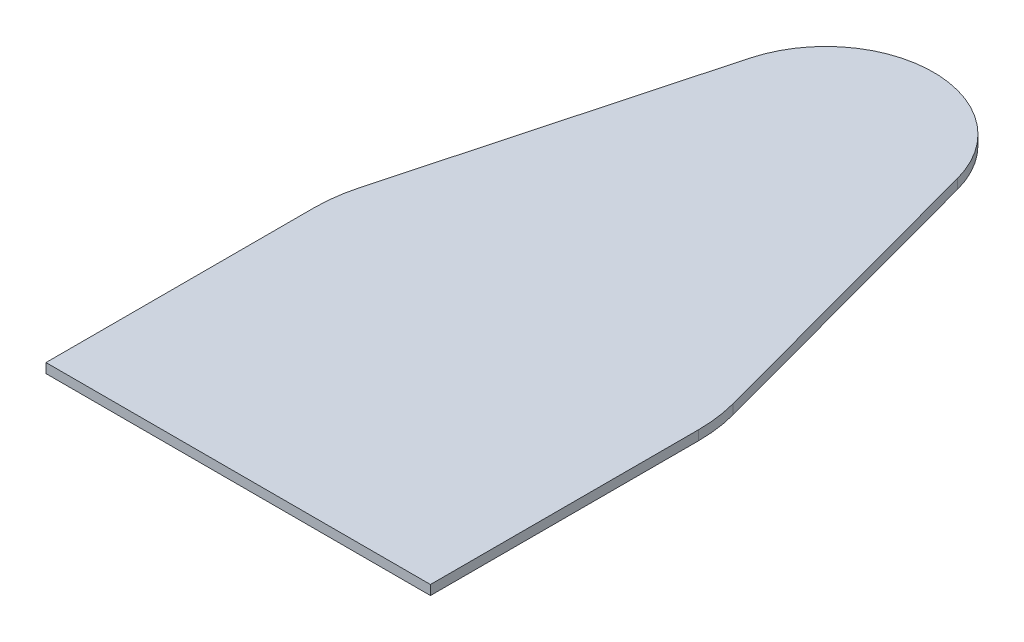
ISO-10303-21;
HEADER;
FILE_DESCRIPTION(('STEP AP214'),'2;1');
FILE_NAME('part.step','',(''),(''),'','','');
FILE_SCHEMA(('AUTOMOTIVE_DESIGN { 1 0 10303 214 1 1 1 1 }'));
ENDSEC;
DATA;
#1=APPLICATION_CONTEXT('core data for automotive mechanical design processes');
#2=APPLICATION_PROTOCOL_DEFINITION('international standard','automotive_design',2000,#1);
#3=PRODUCT_CONTEXT('',#1,'mechanical');
#4=PRODUCT('Part','Part','',(#3));
#5=PRODUCT_RELATED_PRODUCT_CATEGORY('part','',(#4));
#6=PRODUCT_DEFINITION_FORMATION('','',#4);
#7=PRODUCT_DEFINITION_CONTEXT('part definition',#1,'design');
#8=PRODUCT_DEFINITION('design','',#6,#7);
#9=PRODUCT_DEFINITION_SHAPE('','',#8);
#10=(LENGTH_UNIT() NAMED_UNIT(*) SI_UNIT(.MILLI.,.METRE.));
#11=(NAMED_UNIT(*) PLANE_ANGLE_UNIT() SI_UNIT($,.RADIAN.));
#12=(NAMED_UNIT(*) SI_UNIT($,.STERADIAN.) SOLID_ANGLE_UNIT());
#13=UNCERTAINTY_MEASURE_WITH_UNIT(LENGTH_MEASURE(1.E-05),#10,'distance_accuracy_value','');
#14=(GEOMETRIC_REPRESENTATION_CONTEXT(3) GLOBAL_UNCERTAINTY_ASSIGNED_CONTEXT((#13)) GLOBAL_UNIT_ASSIGNED_CONTEXT((#10,
#11,#12)) REPRESENTATION_CONTEXT('',''));
#15=CARTESIAN_POINT('',(0.,0.,0.));
#16=DIRECTION('',(0.,0.,1.));
#17=DIRECTION('',(1.,0.,0.));
#18=AXIS2_PLACEMENT_3D('',#15,#16,#17);
#19=CARTESIAN_POINT('',(0.,3.175,0.));
#20=DIRECTION('',(1.,0.,0.));
#21=DIRECTION('',(0.,0.,-1.));
#22=AXIS2_PLACEMENT_3D('',#19,#20,#21);
#23=PLANE('',#22);
#24=DIRECTION('',(0.,0.,1.));
#25=VECTOR('',#24,1.);
#26=CARTESIAN_POINT('',(0.,0.,0.));
#27=LINE('',#26,#25);
#28=CARTESIAN_POINT('',(0.,0.,-88.5169438554514));
#29=VERTEX_POINT('',#28);
#30=CARTESIAN_POINT('',(0.,0.,0.));
#31=VERTEX_POINT('',#30);
#32=EDGE_CURVE('E140',#29,#31,#27,.T.);
#33=ORIENTED_EDGE('',*,*,#32,.T.);
#34=DIRECTION('',(0.,-1.,0.));
#35=VECTOR('',#34,1.);
#36=CARTESIAN_POINT('',(0.,3.175,0.));
#37=LINE('',#36,#35);
#38=CARTESIAN_POINT('',(0.,3.175,0.));
#39=VERTEX_POINT('',#38);
#40=EDGE_CURVE('E11',#39,#31,#37,.T.);
#41=ORIENTED_EDGE('',*,*,#40,.F.);
#42=DIRECTION('',(0.,0.,1.));
#43=VECTOR('',#42,1.);
#44=CARTESIAN_POINT('',(0.,3.175,0.));
#45=LINE('',#44,#43);
#46=CARTESIAN_POINT('',(0.,3.175,-88.5169438554514));
#47=VERTEX_POINT('',#46);
#48=EDGE_CURVE('E162',#47,#39,#45,.T.);
#49=ORIENTED_EDGE('',*,*,#48,.F.);
#50=DIRECTION('',(0.,-1.,0.));
#51=VECTOR('',#50,1.);
#52=CARTESIAN_POINT('',(0.,3.175,-88.5169438554514));
#53=LINE('',#52,#51);
#54=EDGE_CURVE('E136',#47,#29,#53,.T.);
#55=ORIENTED_EDGE('',*,*,#54,.T.);
#56=EDGE_LOOP('',(#33,#41,#49,#55));
#57=FACE_BOUND('',#56,.T.);
#58=ADVANCED_FACE('F39',(#57),#23,.F.);
#59=CARTESIAN_POINT('',(0.,3.175,0.));
#60=DIRECTION('',(0.,0.,-1.));
#61=DIRECTION('',(-1.,0.,0.));
#62=AXIS2_PLACEMENT_3D('',#59,#60,#61);
#63=PLANE('',#62);
#64=DIRECTION('',(1.,0.,0.));
#65=VECTOR('',#64,1.);
#66=CARTESIAN_POINT('',(0.,0.,0.));
#67=LINE('',#66,#65);
#68=CARTESIAN_POINT('',(127.,0.,0.));
#69=VERTEX_POINT('',#68);
#70=EDGE_CURVE('E144',#31,#69,#67,.T.);
#71=ORIENTED_EDGE('',*,*,#70,.T.);
#72=DIRECTION('',(0.,-1.,0.));
#73=VECTOR('',#72,1.);
#74=CARTESIAN_POINT('',(127.,3.175,0.));
#75=LINE('',#74,#73);
#76=CARTESIAN_POINT('',(127.,3.175,0.));
#77=VERTEX_POINT('',#76);
#78=EDGE_CURVE('E48',#77,#69,#75,.T.);
#79=ORIENTED_EDGE('',*,*,#78,.F.);
#80=DIRECTION('',(1.,0.,0.));
#81=VECTOR('',#80,1.);
#82=CARTESIAN_POINT('',(0.,3.175,0.));
#83=LINE('',#82,#81);
#84=EDGE_CURVE('E99',#39,#77,#83,.T.);
#85=ORIENTED_EDGE('',*,*,#84,.F.);
#86=ORIENTED_EDGE('',*,*,#40,.T.);
#87=EDGE_LOOP('',(#71,#79,#85,#86));
#88=FACE_BOUND('',#87,.T.);
#89=ADVANCED_FACE('F208',(#88),#63,.F.);
#90=CARTESIAN_POINT('',(127.,3.175,0.));
#91=DIRECTION('',(-1.,0.,0.));
#92=DIRECTION('',(0.,0.,1.));
#93=AXIS2_PLACEMENT_3D('',#90,#91,#92);
#94=PLANE('',#93);
#95=DIRECTION('',(0.,0.,-1.));
#96=VECTOR('',#95,1.);
#97=CARTESIAN_POINT('',(127.,0.,0.));
#98=LINE('',#97,#96);
#99=CARTESIAN_POINT('',(127.,0.,-88.5169438554514));
#100=VERTEX_POINT('',#99);
#101=EDGE_CURVE('E147',#69,#100,#98,.T.);
#102=ORIENTED_EDGE('',*,*,#101,.T.);
#103=DIRECTION('',(0.,-1.,0.));
#104=VECTOR('',#103,1.);
#105=CARTESIAN_POINT('',(127.,3.175,-88.5169438554514));
#106=LINE('',#105,#104);
#107=CARTESIAN_POINT('',(127.,3.175,-88.5169438554514));
#108=VERTEX_POINT('',#107);
#109=EDGE_CURVE('E173',#108,#100,#106,.T.);
#110=ORIENTED_EDGE('',*,*,#109,.F.);
#111=DIRECTION('',(0.,0.,-1.));
#112=VECTOR('',#111,1.);
#113=CARTESIAN_POINT('',(127.,3.175,0.));
#114=LINE('',#113,#112);
#115=EDGE_CURVE('E183',#77,#108,#114,.T.);
#116=ORIENTED_EDGE('',*,*,#115,.F.);
#117=ORIENTED_EDGE('',*,*,#78,.T.);
#118=EDGE_LOOP('',(#102,#110,#116,#117));
#119=FACE_BOUND('',#118,.T.);
#120=ADVANCED_FACE('F181',(#119),#94,.F.);
#121=CARTESIAN_POINT('',(76.2,3.175,-88.5169438554514));
#122=DIRECTION('',(0.,-1.,0.));
#123=DIRECTION('',(0.,0.,-1.));
#124=AXIS2_PLACEMENT_3D('',#121,#122,#123);
#125=CYLINDRICAL_SURFACE('',#124,50.8);
#126=CARTESIAN_POINT('',(76.2,0.,-88.5169438554514));
#127=DIRECTION('',(0.,1.,0.));
#128=DIRECTION('',(0.,0.,-1.));
#129=AXIS2_PLACEMENT_3D('',#126,#127,#128);
#130=CIRCLE('',#129,50.8);
#131=CARTESIAN_POINT('',(125.246007425196,0.,-101.750581135035));
#132=VERTEX_POINT('',#131);
#133=EDGE_CURVE('E150',#100,#132,#130,.T.);
#134=ORIENTED_EDGE('',*,*,#133,.T.);
#135=DIRECTION('',(0.,-1.,0.));
#136=VECTOR('',#135,1.);
#137=CARTESIAN_POINT('',(125.246007425196,3.175,-101.750581135035));
#138=LINE('',#137,#136);
#139=CARTESIAN_POINT('',(125.246007425196,3.175,-101.750581135035));
#140=VERTEX_POINT('',#139);
#141=EDGE_CURVE('E169',#140,#132,#138,.T.);
#142=ORIENTED_EDGE('',*,*,#141,.F.);
#143=CARTESIAN_POINT('',(76.2,3.175,-88.5169438554514));
#144=DIRECTION('',(0.,1.,0.));
#145=DIRECTION('',(0.,0.,-1.));
#146=AXIS2_PLACEMENT_3D('',#143,#144,#145);
#147=CIRCLE('',#146,50.8);
#148=EDGE_CURVE('E196',#108,#140,#147,.T.);
#149=ORIENTED_EDGE('',*,*,#148,.F.);
#150=ORIENTED_EDGE('',*,*,#109,.T.);
#151=EDGE_LOOP('',(#134,#142,#149,#150));
#152=FACE_BOUND('',#151,.T.);
#153=ADVANCED_FACE('F191',(#152),#125,.T.);
#154=CARTESIAN_POINT('',(97.8322051976374,3.175,-203.350581135035));
#155=DIRECTION('',(-0.965472587110163,0.,0.260504670857949));
#156=DIRECTION('',(0.260504670857949,0.,0.965472587110163));
#157=AXIS2_PLACEMENT_3D('',#154,#155,#156);
#158=PLANE('',#157);
#159=DIRECTION('',(-0.260504670857949,0.,-0.965472587110163));
#160=VECTOR('',#159,1.);
#161=CARTESIAN_POINT('',(97.8322051976374,0.,-203.350581135035));
#162=LINE('',#161,#160);
#163=CARTESIAN_POINT('',(97.8322051976374,0.,-203.350581135035));
#164=VERTEX_POINT('',#163);
#165=EDGE_CURVE('E153',#132,#164,#162,.T.);
#166=ORIENTED_EDGE('',*,*,#165,.T.);
#167=DIRECTION('',(0.,-1.,0.));
#168=VECTOR('',#167,1.);
#169=CARTESIAN_POINT('',(97.8322051976374,3.175,-203.350581135035));
#170=LINE('',#169,#168);
#171=CARTESIAN_POINT('',(97.8322051976374,3.175,-203.350581135035));
#172=VERTEX_POINT('',#171);
#173=EDGE_CURVE('E129',#172,#164,#170,.T.);
#174=ORIENTED_EDGE('',*,*,#173,.F.);
#175=DIRECTION('',(-0.260504670857949,0.,-0.965472587110163));
#176=VECTOR('',#175,1.);
#177=CARTESIAN_POINT('',(97.8322051976374,3.175,-203.350581135035));
#178=LINE('',#177,#176);
#179=EDGE_CURVE('E118',#140,#172,#178,.T.);
#180=ORIENTED_EDGE('',*,*,#179,.F.);
#181=ORIENTED_EDGE('',*,*,#141,.T.);
#182=EDGE_LOOP('',(#166,#174,#180,#181));
#183=FACE_BOUND('',#182,.T.);
#184=ADVANCED_FACE('F194',(#183),#158,.F.);
#185=CARTESIAN_POINT('',(63.5,3.175,-194.087035039327));
#186=DIRECTION('',(0.,-1.,0.));
#187=DIRECTION('',(0.,0.,-1.));
#188=AXIS2_PLACEMENT_3D('',#185,#186,#187);
#189=CYLINDRICAL_SURFACE('',#188,35.56);
#190=CARTESIAN_POINT('',(63.5,0.,-194.087035039327));
#191=DIRECTION('',(0.,1.,0.));
#192=DIRECTION('',(0.,0.,-1.));
#193=AXIS2_PLACEMENT_3D('',#190,#191,#192);
#194=CIRCLE('',#193,35.56);
#195=CARTESIAN_POINT('',(29.1677948023627,0.,-203.350581135035));
#196=VERTEX_POINT('',#195);
#197=EDGE_CURVE('E127',#164,#196,#194,.T.);
#198=ORIENTED_EDGE('',*,*,#197,.T.);
#199=DIRECTION('',(0.,-1.,0.));
#200=VECTOR('',#199,1.);
#201=CARTESIAN_POINT('',(29.1677948023627,3.175,-203.350581135035));
#202=LINE('',#201,#200);
#203=CARTESIAN_POINT('',(29.1677948023627,3.175,-203.350581135035));
#204=VERTEX_POINT('',#203);
#205=EDGE_CURVE('E124',#204,#196,#202,.T.);
#206=ORIENTED_EDGE('',*,*,#205,.F.);
#207=CARTESIAN_POINT('',(63.5,3.175,-194.087035039327));
#208=DIRECTION('',(0.,1.,0.));
#209=DIRECTION('',(0.,0.,-1.));
#210=AXIS2_PLACEMENT_3D('',#207,#208,#209);
#211=CIRCLE('',#210,35.56);
#212=EDGE_CURVE('E112',#172,#204,#211,.T.);
#213=ORIENTED_EDGE('',*,*,#212,.F.);
#214=ORIENTED_EDGE('',*,*,#173,.T.);
#215=EDGE_LOOP('',(#198,#206,#213,#214));
#216=FACE_BOUND('',#215,.T.);
#217=ADVANCED_FACE('F125',(#216),#189,.T.);
#218=CARTESIAN_POINT('',(1.75399257480372,3.175,-101.750581135035));
#219=DIRECTION('',(0.965472587110163,0.,0.260504670857949));
#220=DIRECTION('',(0.260504670857949,0.,-0.965472587110163));
#221=AXIS2_PLACEMENT_3D('',#218,#219,#220);
#222=PLANE('',#221);
#223=DIRECTION('',(-0.260504670857949,0.,0.965472587110163));
#224=VECTOR('',#223,1.);
#225=CARTESIAN_POINT('',(1.75399257480372,0.,-101.750581135035));
#226=LINE('',#225,#224);
#227=CARTESIAN_POINT('',(1.75399257480372,0.,-101.750581135035));
#228=VERTEX_POINT('',#227);
#229=EDGE_CURVE('E85',#196,#228,#226,.T.);
#230=ORIENTED_EDGE('',*,*,#229,.T.);
#231=DIRECTION('',(0.,-1.,0.));
#232=VECTOR('',#231,1.);
#233=CARTESIAN_POINT('',(1.75399257480372,3.175,-101.750581135035));
#234=LINE('',#233,#232);
#235=CARTESIAN_POINT('',(1.75399257480372,3.175,-101.750581135035));
#236=VERTEX_POINT('',#235);
#237=EDGE_CURVE('E130',#236,#228,#234,.T.);
#238=ORIENTED_EDGE('',*,*,#237,.F.);
#239=DIRECTION('',(-0.260504670857949,0.,0.965472587110163));
#240=VECTOR('',#239,1.);
#241=CARTESIAN_POINT('',(1.75399257480372,3.175,-101.750581135035));
#242=LINE('',#241,#240);
#243=EDGE_CURVE('E116',#204,#236,#242,.T.);
#244=ORIENTED_EDGE('',*,*,#243,.F.);
#245=ORIENTED_EDGE('',*,*,#205,.T.);
#246=EDGE_LOOP('',(#230,#238,#244,#245));
#247=FACE_BOUND('',#246,.T.);
#248=ADVANCED_FACE('F132',(#247),#222,.F.);
#249=CARTESIAN_POINT('',(50.8,3.175,-88.5169438554514));
#250=DIRECTION('',(0.,-1.,0.));
#251=DIRECTION('',(0.,0.,-1.));
#252=AXIS2_PLACEMENT_3D('',#249,#250,#251);
#253=CYLINDRICAL_SURFACE('',#252,50.8);
#254=CARTESIAN_POINT('',(50.8,0.,-88.5169438554514));
#255=DIRECTION('',(0.,1.,0.));
#256=DIRECTION('',(0.,0.,-1.));
#257=AXIS2_PLACEMENT_3D('',#254,#255,#256);
#258=CIRCLE('',#257,50.8);
#259=EDGE_CURVE('E91',#228,#29,#258,.T.);
#260=ORIENTED_EDGE('',*,*,#259,.T.);
#261=ORIENTED_EDGE('',*,*,#54,.F.);
#262=CARTESIAN_POINT('',(50.8,3.175,-88.5169438554514));
#263=DIRECTION('',(0.,1.,0.));
#264=DIRECTION('',(0.,0.,-1.));
#265=AXIS2_PLACEMENT_3D('',#262,#263,#264);
#266=CIRCLE('',#265,50.8);
#267=EDGE_CURVE('E56',#236,#47,#266,.T.);
#268=ORIENTED_EDGE('',*,*,#267,.F.);
#269=ORIENTED_EDGE('',*,*,#237,.T.);
#270=EDGE_LOOP('',(#260,#261,#268,#269));
#271=FACE_BOUND('',#270,.T.);
#272=ADVANCED_FACE('F224',(#271),#253,.T.);
#273=CARTESIAN_POINT('',(50.8,3.175,-88.5169438554514));
#274=DIRECTION('',(0.,-1.,0.));
#275=DIRECTION('',(0.,0.,-1.));
#276=AXIS2_PLACEMENT_3D('',#273,#274,#275);
#277=PLANE('',#276);
#278=ORIENTED_EDGE('',*,*,#48,.T.);
#279=ORIENTED_EDGE('',*,*,#84,.T.);
#280=ORIENTED_EDGE('',*,*,#115,.T.);
#281=ORIENTED_EDGE('',*,*,#148,.T.);
#282=ORIENTED_EDGE('',*,*,#179,.T.);
#283=ORIENTED_EDGE('',*,*,#212,.T.);
#284=ORIENTED_EDGE('',*,*,#243,.T.);
#285=ORIENTED_EDGE('',*,*,#267,.T.);
#286=EDGE_LOOP('',(#278,#279,#280,#281,#282,#283,#284,#285));
#287=FACE_BOUND('',#286,.T.);
#288=ADVANCED_FACE('F114',(#287),#277,.F.);
#289=CARTESIAN_POINT('',(50.8,0.,-88.5169438554514));
#290=DIRECTION('',(0.,-1.,0.));
#291=DIRECTION('',(0.,0.,-1.));
#292=AXIS2_PLACEMENT_3D('',#289,#290,#291);
#293=PLANE('',#292);
#294=ORIENTED_EDGE('',*,*,#32,.F.);
#295=ORIENTED_EDGE('',*,*,#259,.F.);
#296=ORIENTED_EDGE('',*,*,#229,.F.);
#297=ORIENTED_EDGE('',*,*,#197,.F.);
#298=ORIENTED_EDGE('',*,*,#165,.F.);
#299=ORIENTED_EDGE('',*,*,#133,.F.);
#300=ORIENTED_EDGE('',*,*,#101,.F.);
#301=ORIENTED_EDGE('',*,*,#70,.F.);
#302=EDGE_LOOP('',(#294,#295,#296,#297,#298,#299,#300,#301));
#303=FACE_BOUND('',#302,.T.);
#304=ADVANCED_FACE('F187',(#303),#293,.T.);
#305=CLOSED_SHELL('',(#58,#89,#120,#153,#184,#217,#248,#272,#288,#304));
#306=MANIFOLD_SOLID_BREP('B2',#305);
#307=ADVANCED_BREP_SHAPE_REPRESENTATION('',(#18,#306),#14);
#308=SHAPE_DEFINITION_REPRESENTATION(#9,#307);
ENDSEC;
END-ISO-10303-21;
